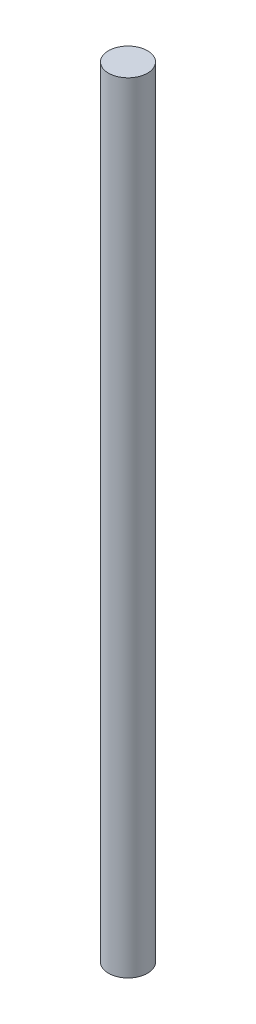
ISO-10303-21;
HEADER;
FILE_DESCRIPTION(('STEP AP214'),'2;1');
FILE_NAME('part.step','',(''),(''),'','','');
FILE_SCHEMA(('AUTOMOTIVE_DESIGN { 1 0 10303 214 1 1 1 1 }'));
ENDSEC;
DATA;
#1=APPLICATION_CONTEXT('core data for automotive mechanical design processes');
#2=APPLICATION_PROTOCOL_DEFINITION('international standard','automotive_design',2000,#1);
#3=PRODUCT_CONTEXT('',#1,'mechanical');
#4=PRODUCT('Part','Part','',(#3));
#5=PRODUCT_RELATED_PRODUCT_CATEGORY('part','',(#4));
#6=PRODUCT_DEFINITION_FORMATION('','',#4);
#7=PRODUCT_DEFINITION_CONTEXT('part definition',#1,'design');
#8=PRODUCT_DEFINITION('design','',#6,#7);
#9=PRODUCT_DEFINITION_SHAPE('','',#8);
#10=(LENGTH_UNIT() NAMED_UNIT(*) SI_UNIT(.MILLI.,.METRE.));
#11=(NAMED_UNIT(*) PLANE_ANGLE_UNIT() SI_UNIT($,.RADIAN.));
#12=(NAMED_UNIT(*) SI_UNIT($,.STERADIAN.) SOLID_ANGLE_UNIT());
#13=UNCERTAINTY_MEASURE_WITH_UNIT(LENGTH_MEASURE(1.E-05),#10,'distance_accuracy_value','');
#14=(GEOMETRIC_REPRESENTATION_CONTEXT(3) GLOBAL_UNCERTAINTY_ASSIGNED_CONTEXT((#13)) GLOBAL_UNIT_ASSIGNED_CONTEXT((#10,
#11,#12)) REPRESENTATION_CONTEXT('',''));
#15=CARTESIAN_POINT('',(0.,0.,0.));
#16=DIRECTION('',(0.,0.,1.));
#17=DIRECTION('',(1.,0.,0.));
#18=AXIS2_PLACEMENT_3D('',#15,#16,#17);
#19=CARTESIAN_POINT('',(0.,140.,0.));
#20=DIRECTION('',(0.,-1.,0.));
#21=DIRECTION('',(0.,0.,-1.));
#22=AXIS2_PLACEMENT_3D('',#19,#20,#21);
#23=CYLINDRICAL_SURFACE('',#22,3.5);
#24=CARTESIAN_POINT('',(0.,140.,0.));
#25=DIRECTION('',(0.,1.,0.));
#26=DIRECTION('',(0.,0.,1.));
#27=AXIS2_PLACEMENT_3D('',#24,#25,#26);
#28=CIRCLE('',#27,3.5);
#29=CARTESIAN_POINT('',(0.,140.,3.5));
#30=VERTEX_POINT('',#29);
#31=EDGE_CURVE('E10',#30,#30,#28,.T.);
#32=ORIENTED_EDGE('',*,*,#31,.F.);
#33=EDGE_LOOP('',(#32));
#34=FACE_BOUND('',#33,.T.);
#35=CARTESIAN_POINT('',(0.,0.,0.));
#36=DIRECTION('',(0.,1.,0.));
#37=DIRECTION('',(0.,0.,1.));
#38=AXIS2_PLACEMENT_3D('',#35,#36,#37);
#39=CIRCLE('',#38,3.5);
#40=CARTESIAN_POINT('',(0.,0.,3.5));
#41=VERTEX_POINT('',#40);
#42=EDGE_CURVE('E34',#41,#41,#39,.T.);
#43=ORIENTED_EDGE('',*,*,#42,.T.);
#44=EDGE_LOOP('',(#43));
#45=FACE_BOUND('',#44,.T.);
#46=ADVANCED_FACE('F31',(#34,#45),#23,.T.);
#47=CARTESIAN_POINT('',(0.,140.,0.));
#48=DIRECTION('',(0.,1.,0.));
#49=DIRECTION('',(0.,0.,1.));
#50=AXIS2_PLACEMENT_3D('',#47,#48,#49);
#51=PLANE('',#50);
#52=ORIENTED_EDGE('',*,*,#31,.T.);
#53=EDGE_LOOP('',(#52));
#54=FACE_BOUND('',#53,.T.);
#55=ADVANCED_FACE('F46',(#54),#51,.T.);
#56=CARTESIAN_POINT('',(0.,0.,0.));
#57=DIRECTION('',(0.,1.,0.));
#58=DIRECTION('',(0.,0.,1.));
#59=AXIS2_PLACEMENT_3D('',#56,#57,#58);
#60=PLANE('',#59);
#61=ORIENTED_EDGE('',*,*,#42,.F.);
#62=EDGE_LOOP('',(#61));
#63=FACE_BOUND('',#62,.T.);
#64=ADVANCED_FACE('F44',(#63),#60,.F.);
#65=CLOSED_SHELL('',(#46,#55,#64));
#66=MANIFOLD_SOLID_BREP('B2',#65);
#67=ADVANCED_BREP_SHAPE_REPRESENTATION('',(#18,#66),#14);
#68=SHAPE_DEFINITION_REPRESENTATION(#9,#67);
ENDSEC;
END-ISO-10303-21;
